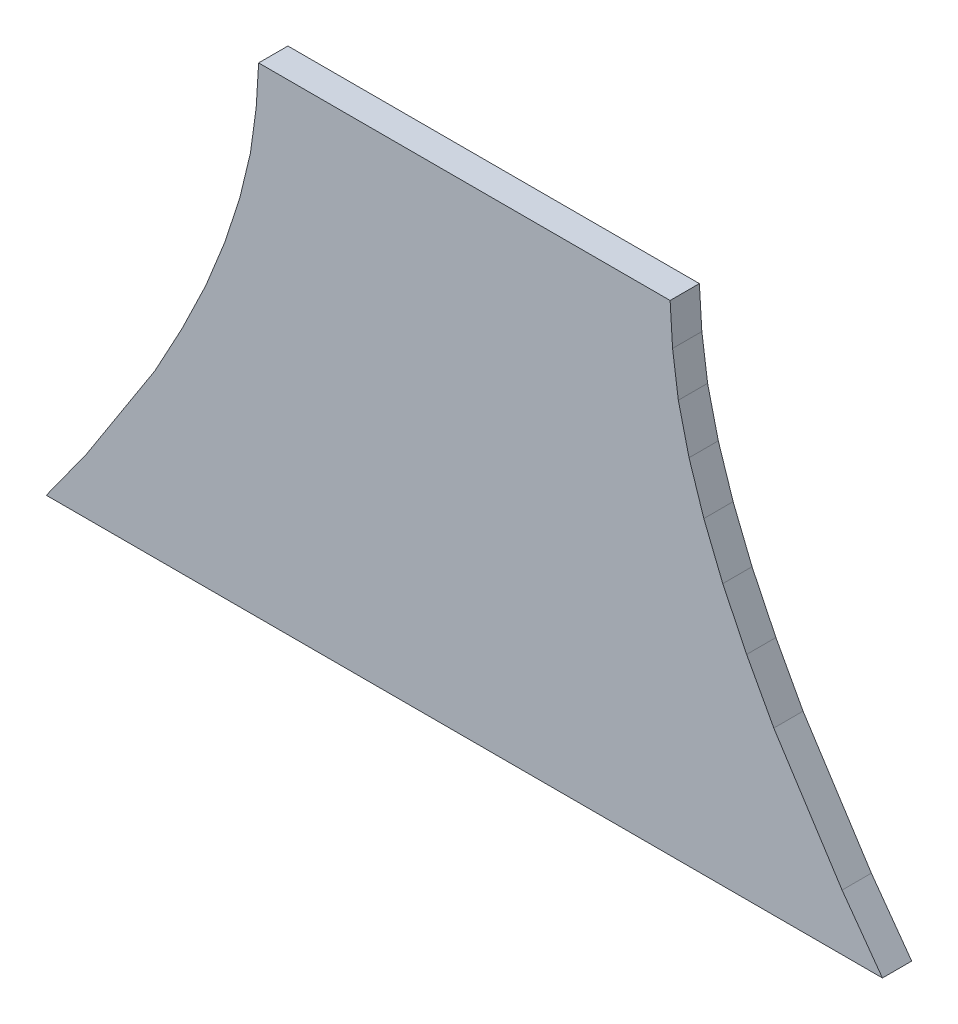
ISO-10303-21;
HEADER;
FILE_DESCRIPTION(('STEP AP214'),'2;1');
FILE_NAME('part.step','',(''),(''),'','','');
FILE_SCHEMA(('AUTOMOTIVE_DESIGN { 1 0 10303 214 1 1 1 1 }'));
ENDSEC;
DATA;
#1=APPLICATION_CONTEXT('core data for automotive mechanical design processes');
#2=APPLICATION_PROTOCOL_DEFINITION('international standard','automotive_design',2000,#1);
#3=PRODUCT_CONTEXT('',#1,'mechanical');
#4=PRODUCT('Part','Part','',(#3));
#5=PRODUCT_RELATED_PRODUCT_CATEGORY('part','',(#4));
#6=PRODUCT_DEFINITION_FORMATION('','',#4);
#7=PRODUCT_DEFINITION_CONTEXT('part definition',#1,'design');
#8=PRODUCT_DEFINITION('design','',#6,#7);
#9=PRODUCT_DEFINITION_SHAPE('','',#8);
#10=(LENGTH_UNIT() NAMED_UNIT(*) SI_UNIT(.MILLI.,.METRE.));
#11=(NAMED_UNIT(*) PLANE_ANGLE_UNIT() SI_UNIT($,.RADIAN.));
#12=(NAMED_UNIT(*) SI_UNIT($,.STERADIAN.) SOLID_ANGLE_UNIT());
#13=UNCERTAINTY_MEASURE_WITH_UNIT(LENGTH_MEASURE(1.E-05),#10,'distance_accuracy_value','');
#14=(GEOMETRIC_REPRESENTATION_CONTEXT(3) GLOBAL_UNCERTAINTY_ASSIGNED_CONTEXT((#13)) GLOBAL_UNIT_ASSIGNED_CONTEXT((#10,
#11,#12)) REPRESENTATION_CONTEXT('',''));
#15=CARTESIAN_POINT('',(0.,0.,0.));
#16=DIRECTION('',(0.,0.,1.));
#17=DIRECTION('',(1.,0.,0.));
#18=AXIS2_PLACEMENT_3D('',#15,#16,#17);
#19=CARTESIAN_POINT('',(53.6500015258789,72.4649963378906,0.));
#20=DIRECTION('',(0.998128033533302,-0.0611590440976883,0.));
#21=DIRECTION('',(-0.0611590440976883,-0.998128033533302,0.));
#22=AXIS2_PLACEMENT_3D('',#19,#20,#21);
#23=PLANE('',#22);
#24=DIRECTION('',(-0.0611590440976883,-0.998128033533302,0.));
#25=VECTOR('',#24,1.);
#26=CARTESIAN_POINT('',(53.6500015258789,72.4649963378906,0.03556));
#27=LINE('',#26,#25);
#28=CARTESIAN_POINT('',(53.6500015258789,72.4649963378906,0.03556));
#29=VERTEX_POINT('',#28);
#30=CARTESIAN_POINT('',(53.6469993591309,72.4160003662109,0.03556));
#31=VERTEX_POINT('',#30);
#32=EDGE_CURVE('E11',#29,#31,#27,.T.);
#33=ORIENTED_EDGE('',*,*,#32,.F.);
#34=DIRECTION('',(0.,0.,1.));
#35=VECTOR('',#34,1.);
#36=CARTESIAN_POINT('',(53.6500015258789,72.4649963378906,0.));
#37=LINE('',#36,#35);
#38=CARTESIAN_POINT('',(53.6500015258789,72.4649963378906,0.));
#39=VERTEX_POINT('',#38);
#40=EDGE_CURVE('E24',#39,#29,#37,.T.);
#41=ORIENTED_EDGE('',*,*,#40,.F.);
#42=DIRECTION('',(-0.0611590440976883,-0.998128033533302,0.));
#43=VECTOR('',#42,1.);
#44=CARTESIAN_POINT('',(53.6500015258789,72.4649963378906,0.));
#45=LINE('',#44,#43);
#46=CARTESIAN_POINT('',(53.6469993591309,72.4160003662109,0.));
#47=VERTEX_POINT('',#46);
#48=EDGE_CURVE('E172',#39,#47,#45,.T.);
#49=ORIENTED_EDGE('',*,*,#48,.T.);
#50=DIRECTION('',(0.,0.,1.));
#51=VECTOR('',#50,1.);
#52=CARTESIAN_POINT('',(53.6469993591309,72.4160003662109,0.));
#53=LINE('',#52,#51);
#54=EDGE_CURVE('E37',#47,#31,#53,.T.);
#55=ORIENTED_EDGE('',*,*,#54,.T.);
#56=EDGE_LOOP('',(#33,#41,#49,#55));
#57=FACE_BOUND('',#56,.T.);
#58=ADVANCED_FACE('F17',(#57),#23,.F.);
#59=CARTESIAN_POINT('',(53.6469993591309,72.416000366211,0.));
#60=DIRECTION('',(0.990712558253608,-0.135972890381105,0.));
#61=DIRECTION('',(-0.135972890381105,-0.990712558253608,0.));
#62=AXIS2_PLACEMENT_3D('',#59,#60,#61);
#63=PLANE('',#62);
#64=DIRECTION('',(-0.135972890381105,-0.990712558253608,0.));
#65=VECTOR('',#64,1.);
#66=CARTESIAN_POINT('',(53.6469993591309,72.4160003662109,0.03556));
#67=LINE('',#66,#65);
#68=CARTESIAN_POINT('',(53.6399993896484,72.3649978637695,0.03556));
#69=VERTEX_POINT('',#68);
#70=EDGE_CURVE('E308',#31,#69,#67,.T.);
#71=ORIENTED_EDGE('',*,*,#70,.F.);
#72=ORIENTED_EDGE('',*,*,#54,.F.);
#73=DIRECTION('',(-0.135972890381105,-0.990712558253608,0.));
#74=VECTOR('',#73,1.);
#75=CARTESIAN_POINT('',(53.6469993591309,72.4160003662109,0.));
#76=LINE('',#75,#74);
#77=CARTESIAN_POINT('',(53.6399993896484,72.3649978637695,0.));
#78=VERTEX_POINT('',#77);
#79=EDGE_CURVE('E305',#47,#78,#76,.T.);
#80=ORIENTED_EDGE('',*,*,#79,.T.);
#81=DIRECTION('',(0.,0.,1.));
#82=VECTOR('',#81,1.);
#83=CARTESIAN_POINT('',(53.6399993896484,72.3649978637695,0.));
#84=LINE('',#83,#82);
#85=EDGE_CURVE('E303',#78,#69,#84,.T.);
#86=ORIENTED_EDGE('',*,*,#85,.T.);
#87=EDGE_LOOP('',(#71,#72,#80,#86));
#88=FACE_BOUND('',#87,.T.);
#89=ADVANCED_FACE('F316',(#88),#63,.F.);
#90=CARTESIAN_POINT('',(53.6399993896484,72.3649978637695,0.));
#91=DIRECTION('',(0.972222479506538,-0.234058647227909,0.));
#92=DIRECTION('',(-0.234058647227909,-0.972222479506538,0.));
#93=AXIS2_PLACEMENT_3D('',#90,#91,#92);
#94=PLANE('',#93);
#95=DIRECTION('',(-0.234058647227909,-0.972222479506538,0.));
#96=VECTOR('',#95,1.);
#97=CARTESIAN_POINT('',(53.6399993896484,72.3649978637695,0.03556));
#98=LINE('',#97,#96);
#99=CARTESIAN_POINT('',(53.6269989013672,72.3109970092774,0.03556));
#100=VERTEX_POINT('',#99);
#101=EDGE_CURVE('E300',#69,#100,#98,.T.);
#102=ORIENTED_EDGE('',*,*,#101,.F.);
#103=ORIENTED_EDGE('',*,*,#85,.F.);
#104=DIRECTION('',(-0.234058647227909,-0.972222479506538,0.));
#105=VECTOR('',#104,1.);
#106=CARTESIAN_POINT('',(53.6399993896484,72.3649978637695,0.));
#107=LINE('',#106,#105);
#108=CARTESIAN_POINT('',(53.6269989013672,72.3109970092774,0.));
#109=VERTEX_POINT('',#108);
#110=EDGE_CURVE('E297',#78,#109,#107,.T.);
#111=ORIENTED_EDGE('',*,*,#110,.T.);
#112=DIRECTION('',(0.,0.,1.));
#113=VECTOR('',#112,1.);
#114=CARTESIAN_POINT('',(53.6269989013672,72.3109970092774,0.));
#115=LINE('',#114,#113);
#116=EDGE_CURVE('E295',#109,#100,#115,.T.);
#117=ORIENTED_EDGE('',*,*,#116,.T.);
#118=EDGE_LOOP('',(#102,#103,#111,#117));
#119=FACE_BOUND('',#118,.T.);
#120=ADVANCED_FACE('F322',(#119),#94,.F.);
#121=CARTESIAN_POINT('',(53.6269989013672,72.3109970092774,0.));
#122=DIRECTION('',(0.950409174304617,-0.311002253042668,0.));
#123=DIRECTION('',(-0.311002253042668,-0.950409174304617,0.));
#124=AXIS2_PLACEMENT_3D('',#121,#122,#123);
#125=PLANE('',#124);
#126=DIRECTION('',(-0.311002253042668,-0.950409174304617,0.));
#127=VECTOR('',#126,1.);
#128=CARTESIAN_POINT('',(53.6269989013672,72.3109970092774,0.03556));
#129=LINE('',#128,#127);
#130=CARTESIAN_POINT('',(53.609001159668,72.2559967041016,0.03556));
#131=VERTEX_POINT('',#130);
#132=EDGE_CURVE('E292',#100,#131,#129,.T.);
#133=ORIENTED_EDGE('',*,*,#132,.F.);
#134=ORIENTED_EDGE('',*,*,#116,.F.);
#135=DIRECTION('',(-0.311002253042668,-0.950409174304617,0.));
#136=VECTOR('',#135,1.);
#137=CARTESIAN_POINT('',(53.6269989013672,72.3109970092774,0.));
#138=LINE('',#137,#136);
#139=CARTESIAN_POINT('',(53.609001159668,72.2559967041016,0.));
#140=VERTEX_POINT('',#139);
#141=EDGE_CURVE('E289',#109,#140,#138,.T.);
#142=ORIENTED_EDGE('',*,*,#141,.T.);
#143=DIRECTION('',(0.,0.,1.));
#144=VECTOR('',#143,1.);
#145=CARTESIAN_POINT('',(53.609001159668,72.2559967041016,0.));
#146=LINE('',#145,#144);
#147=EDGE_CURVE('E287',#140,#131,#146,.T.);
#148=ORIENTED_EDGE('',*,*,#147,.T.);
#149=EDGE_LOOP('',(#133,#134,#142,#148));
#150=FACE_BOUND('',#149,.T.);
#151=ADVANCED_FACE('F324',(#150),#125,.F.);
#152=CARTESIAN_POINT('',(53.609001159668,72.2559967041016,0.));
#153=DIRECTION('',(0.927333807250236,-0.374235233417141,0.));
#154=DIRECTION('',(-0.374235233417141,-0.927333807250236,0.));
#155=AXIS2_PLACEMENT_3D('',#152,#153,#154);
#156=PLANE('',#155);
#157=DIRECTION('',(-0.374235233417141,-0.927333807250236,0.));
#158=VECTOR('',#157,1.);
#159=CARTESIAN_POINT('',(53.609001159668,72.2559967041016,0.03556));
#160=LINE('',#159,#158);
#161=CARTESIAN_POINT('',(53.5859985351563,72.1989974975586,0.03556));
#162=VERTEX_POINT('',#161);
#163=EDGE_CURVE('E284',#131,#162,#160,.T.);
#164=ORIENTED_EDGE('',*,*,#163,.F.);
#165=ORIENTED_EDGE('',*,*,#147,.F.);
#166=DIRECTION('',(-0.374235233417141,-0.927333807250236,0.));
#167=VECTOR('',#166,1.);
#168=CARTESIAN_POINT('',(53.609001159668,72.2559967041016,0.));
#169=LINE('',#168,#167);
#170=CARTESIAN_POINT('',(53.5859985351563,72.1989974975586,0.));
#171=VERTEX_POINT('',#170);
#172=EDGE_CURVE('E281',#140,#171,#169,.T.);
#173=ORIENTED_EDGE('',*,*,#172,.T.);
#174=DIRECTION('',(0.,0.,1.));
#175=VECTOR('',#174,1.);
#176=CARTESIAN_POINT('',(53.5859985351563,72.1989974975586,0.));
#177=LINE('',#176,#175);
#178=EDGE_CURVE('E279',#171,#162,#177,.T.);
#179=ORIENTED_EDGE('',*,*,#178,.T.);
#180=EDGE_LOOP('',(#164,#165,#173,#179));
#181=FACE_BOUND('',#180,.T.);
#182=ADVANCED_FACE('F329',(#181),#156,.F.);
#183=CARTESIAN_POINT('',(53.5859985351563,72.1989974975586,0.));
#184=DIRECTION('',(0.900345962325327,-0.435174847761771,0.));
#185=DIRECTION('',(-0.435174847761771,-0.900345962325327,0.));
#186=AXIS2_PLACEMENT_3D('',#183,#184,#185);
#187=PLANE('',#186);
#188=DIRECTION('',(-0.435174847761771,-0.900345962325327,0.));
#189=VECTOR('',#188,1.);
#190=CARTESIAN_POINT('',(53.5859985351563,72.1989974975586,0.03556));
#191=LINE('',#190,#189);
#192=CARTESIAN_POINT('',(53.556999206543,72.1389999389648,0.03556));
#193=VERTEX_POINT('',#192);
#194=EDGE_CURVE('E276',#162,#193,#191,.T.);
#195=ORIENTED_EDGE('',*,*,#194,.F.);
#196=ORIENTED_EDGE('',*,*,#178,.F.);
#197=DIRECTION('',(-0.435174847761771,-0.900345962325327,0.));
#198=VECTOR('',#197,1.);
#199=CARTESIAN_POINT('',(53.5859985351563,72.1989974975586,0.));
#200=LINE('',#199,#198);
#201=CARTESIAN_POINT('',(53.556999206543,72.1389999389648,0.));
#202=VERTEX_POINT('',#201);
#203=EDGE_CURVE('E273',#171,#202,#200,.T.);
#204=ORIENTED_EDGE('',*,*,#203,.T.);
#205=DIRECTION('',(0.,0.,1.));
#206=VECTOR('',#205,1.);
#207=CARTESIAN_POINT('',(53.556999206543,72.1389999389648,0.));
#208=LINE('',#207,#206);
#209=EDGE_CURVE('E271',#202,#193,#208,.T.);
#210=ORIENTED_EDGE('',*,*,#209,.T.);
#211=EDGE_LOOP('',(#195,#196,#204,#210));
#212=FACE_BOUND('',#211,.T.);
#213=ADVANCED_FACE('F332',(#212),#187,.F.);
#214=CARTESIAN_POINT('',(53.556999206543,72.1389999389648,0.));
#215=DIRECTION('',(0.879527973380277,-0.475847185598047,0.));
#216=DIRECTION('',(-0.475847185598047,-0.879527973380277,0.));
#217=AXIS2_PLACEMENT_3D('',#214,#215,#216);
#218=PLANE('',#217);
#219=DIRECTION('',(-0.475847185598047,-0.879527973380277,0.));
#220=VECTOR('',#219,1.);
#221=CARTESIAN_POINT('',(53.556999206543,72.1389999389648,0.03556));
#222=LINE('',#221,#220);
#223=CARTESIAN_POINT('',(53.523998260498,72.0780029296875,0.03556));
#224=VERTEX_POINT('',#223);
#225=EDGE_CURVE('E268',#193,#224,#222,.T.);
#226=ORIENTED_EDGE('',*,*,#225,.F.);
#227=ORIENTED_EDGE('',*,*,#209,.F.);
#228=DIRECTION('',(-0.475847185598047,-0.879527973380277,0.));
#229=VECTOR('',#228,1.);
#230=CARTESIAN_POINT('',(53.556999206543,72.1389999389648,0.));
#231=LINE('',#230,#229);
#232=CARTESIAN_POINT('',(53.523998260498,72.0780029296875,0.));
#233=VERTEX_POINT('',#232);
#234=EDGE_CURVE('E265',#202,#233,#231,.T.);
#235=ORIENTED_EDGE('',*,*,#234,.T.);
#236=DIRECTION('',(0.,0.,1.));
#237=VECTOR('',#236,1.);
#238=CARTESIAN_POINT('',(53.523998260498,72.0780029296875,0.));
#239=LINE('',#238,#237);
#240=EDGE_CURVE('E263',#233,#224,#239,.T.);
#241=ORIENTED_EDGE('',*,*,#240,.T.);
#242=EDGE_LOOP('',(#226,#227,#235,#241));
#243=FACE_BOUND('',#242,.T.);
#244=ADVANCED_FACE('F337',(#243),#218,.F.);
#245=CARTESIAN_POINT('',(53.523998260498,72.0780029296875,0.));
#246=DIRECTION('',(0.840987738097745,-0.541054178774399,0.));
#247=DIRECTION('',(-0.541054178774399,-0.840987738097745,0.));
#248=AXIS2_PLACEMENT_3D('',#245,#246,#247);
#249=PLANE('',#248);
#250=DIRECTION('',(-0.541054178774399,-0.840987738097745,0.));
#251=VECTOR('',#250,1.);
#252=CARTESIAN_POINT('',(53.523998260498,72.0780029296875,0.03556));
#253=LINE('',#252,#251);
#254=CARTESIAN_POINT('',(53.4410018920898,71.9489974975586,0.03556));
#255=VERTEX_POINT('',#254);
#256=EDGE_CURVE('E260',#224,#255,#253,.T.);
#257=ORIENTED_EDGE('',*,*,#256,.F.);
#258=ORIENTED_EDGE('',*,*,#240,.F.);
#259=DIRECTION('',(-0.541054178774399,-0.840987738097745,0.));
#260=VECTOR('',#259,1.);
#261=CARTESIAN_POINT('',(53.523998260498,72.0780029296875,0.));
#262=LINE('',#261,#260);
#263=CARTESIAN_POINT('',(53.4410018920898,71.9489974975586,0.));
#264=VERTEX_POINT('',#263);
#265=EDGE_CURVE('E257',#233,#264,#262,.T.);
#266=ORIENTED_EDGE('',*,*,#265,.T.);
#267=DIRECTION('',(0.,0.,1.));
#268=VECTOR('',#267,1.);
#269=CARTESIAN_POINT('',(53.4410018920898,71.9489974975586,0.));
#270=LINE('',#269,#268);
#271=EDGE_CURVE('E255',#264,#255,#270,.T.);
#272=ORIENTED_EDGE('',*,*,#271,.T.);
#273=EDGE_LOOP('',(#257,#258,#266,#272));
#274=FACE_BOUND('',#273,.T.);
#275=ADVANCED_FACE('F340',(#274),#249,.F.);
#276=CARTESIAN_POINT('',(53.4410018920899,71.9489974975586,0.));
#277=DIRECTION('',(0.811290838795875,-0.584642775450006,0.));
#278=DIRECTION('',(-0.584642775450006,-0.811290838795875,0.));
#279=AXIS2_PLACEMENT_3D('',#276,#277,#278);
#280=PLANE('',#279);
#281=DIRECTION('',(-0.584642775450006,-0.811290838795875,0.));
#282=VECTOR('',#281,1.);
#283=CARTESIAN_POINT('',(53.4410018920898,71.9489974975586,0.03556));
#284=LINE('',#283,#282);
#285=CARTESIAN_POINT('',(53.3919982910156,71.8809967041016,0.03556));
#286=VERTEX_POINT('',#285);
#287=EDGE_CURVE('E252',#255,#286,#284,.T.);
#288=ORIENTED_EDGE('',*,*,#287,.F.);
#289=ORIENTED_EDGE('',*,*,#271,.F.);
#290=DIRECTION('',(-0.584642775450006,-0.811290838795875,0.));
#291=VECTOR('',#290,1.);
#292=CARTESIAN_POINT('',(53.4410018920898,71.9489974975586,0.));
#293=LINE('',#292,#291);
#294=CARTESIAN_POINT('',(53.3919982910156,71.8809967041016,0.));
#295=VERTEX_POINT('',#294);
#296=EDGE_CURVE('E249',#264,#295,#293,.T.);
#297=ORIENTED_EDGE('',*,*,#296,.T.);
#298=DIRECTION('',(0.,0.,1.));
#299=VECTOR('',#298,1.);
#300=CARTESIAN_POINT('',(53.3919982910156,71.8809967041016,0.));
#301=LINE('',#300,#299);
#302=EDGE_CURVE('E247',#295,#286,#301,.T.);
#303=ORIENTED_EDGE('',*,*,#302,.T.);
#304=EDGE_LOOP('',(#288,#289,#297,#303));
#305=FACE_BOUND('',#304,.T.);
#306=ADVANCED_FACE('F345',(#305),#280,.F.);
#307=CARTESIAN_POINT('',(53.3919982910156,71.8809967041016,0.));
#308=DIRECTION('',(0.,1.,0.));
#309=DIRECTION('',(1.,0.,0.));
#310=AXIS2_PLACEMENT_3D('',#307,#308,#309);
#311=PLANE('',#310);
#312=DIRECTION('',(1.,0.,0.));
#313=VECTOR('',#312,1.);
#314=CARTESIAN_POINT('',(53.3919982910156,71.8809967041016,0.03556));
#315=LINE('',#314,#313);
#316=CARTESIAN_POINT('',(54.4080009460449,71.8809967041016,0.03556));
#317=VERTEX_POINT('',#316);
#318=EDGE_CURVE('E244',#286,#317,#315,.T.);
#319=ORIENTED_EDGE('',*,*,#318,.F.);
#320=ORIENTED_EDGE('',*,*,#302,.F.);
#321=DIRECTION('',(1.,0.,0.));
#322=VECTOR('',#321,1.);
#323=CARTESIAN_POINT('',(53.3919982910156,71.8809967041016,0.));
#324=LINE('',#323,#322);
#325=CARTESIAN_POINT('',(54.4080009460449,71.8809967041016,0.));
#326=VERTEX_POINT('',#325);
#327=EDGE_CURVE('E241',#295,#326,#324,.T.);
#328=ORIENTED_EDGE('',*,*,#327,.T.);
#329=DIRECTION('',(0.,0.,1.));
#330=VECTOR('',#329,1.);
#331=CARTESIAN_POINT('',(54.4080009460449,71.8809967041016,0.));
#332=LINE('',#331,#330);
#333=EDGE_CURVE('E239',#326,#317,#332,.T.);
#334=ORIENTED_EDGE('',*,*,#333,.T.);
#335=EDGE_LOOP('',(#319,#320,#328,#334));
#336=FACE_BOUND('',#335,.T.);
#337=ADVANCED_FACE('F348',(#336),#311,.F.);
#338=CARTESIAN_POINT('',(54.4080009460449,71.8809967041016,0.));
#339=DIRECTION('',(-0.811312425694803,-0.584612818806785,0.));
#340=DIRECTION('',(-0.584612818806785,0.811312425694803,0.));
#341=AXIS2_PLACEMENT_3D('',#338,#339,#340);
#342=PLANE('',#341);
#343=DIRECTION('',(-0.584612818806785,0.811312425694803,0.));
#344=VECTOR('',#343,1.);
#345=CARTESIAN_POINT('',(54.4080009460449,71.8809967041016,0.03556));
#346=LINE('',#345,#344);
#347=CARTESIAN_POINT('',(54.359001159668,71.9489974975586,0.03556));
#348=VERTEX_POINT('',#347);
#349=EDGE_CURVE('E236',#317,#348,#346,.T.);
#350=ORIENTED_EDGE('',*,*,#349,.F.);
#351=ORIENTED_EDGE('',*,*,#333,.F.);
#352=DIRECTION('',(-0.584612818806785,0.811312425694803,0.));
#353=VECTOR('',#352,1.);
#354=CARTESIAN_POINT('',(54.4080009460449,71.8809967041016,0.));
#355=LINE('',#354,#353);
#356=CARTESIAN_POINT('',(54.359001159668,71.9489974975586,0.));
#357=VERTEX_POINT('',#356);
#358=EDGE_CURVE('E233',#326,#357,#355,.T.);
#359=ORIENTED_EDGE('',*,*,#358,.T.);
#360=DIRECTION('',(0.,0.,1.));
#361=VECTOR('',#360,1.);
#362=CARTESIAN_POINT('',(54.359001159668,71.9489974975586,0.));
#363=LINE('',#362,#361);
#364=EDGE_CURVE('E231',#357,#348,#363,.T.);
#365=ORIENTED_EDGE('',*,*,#364,.T.);
#366=EDGE_LOOP('',(#350,#351,#359,#365));
#367=FACE_BOUND('',#366,.T.);
#368=ADVANCED_FACE('F353',(#367),#342,.F.);
#369=CARTESIAN_POINT('',(54.359001159668,71.9489974975586,0.));
#370=DIRECTION('',(-0.8409764226074,-0.541071766606298,0.));
#371=DIRECTION('',(-0.541071766606298,0.8409764226074,0.));
#372=AXIS2_PLACEMENT_3D('',#369,#370,#371);
#373=PLANE('',#372);
#374=DIRECTION('',(-0.541071766606298,0.8409764226074,0.));
#375=VECTOR('',#374,1.);
#376=CARTESIAN_POINT('',(54.359001159668,71.9489974975586,0.03556));
#377=LINE('',#376,#375);
#378=CARTESIAN_POINT('',(54.2760009765625,72.0780029296875,0.03556));
#379=VERTEX_POINT('',#378);
#380=EDGE_CURVE('E228',#348,#379,#377,.T.);
#381=ORIENTED_EDGE('',*,*,#380,.F.);
#382=ORIENTED_EDGE('',*,*,#364,.F.);
#383=DIRECTION('',(-0.541071766606298,0.8409764226074,0.));
#384=VECTOR('',#383,1.);
#385=CARTESIAN_POINT('',(54.359001159668,71.9489974975586,0.));
#386=LINE('',#385,#384);
#387=CARTESIAN_POINT('',(54.2760009765625,72.0780029296875,0.));
#388=VERTEX_POINT('',#387);
#389=EDGE_CURVE('E225',#357,#388,#386,.T.);
#390=ORIENTED_EDGE('',*,*,#389,.T.);
#391=DIRECTION('',(0.,0.,1.));
#392=VECTOR('',#391,1.);
#393=CARTESIAN_POINT('',(54.2760009765625,72.0780029296875,0.));
#394=LINE('',#393,#392);
#395=EDGE_CURVE('E223',#388,#379,#394,.T.);
#396=ORIENTED_EDGE('',*,*,#395,.T.);
#397=EDGE_LOOP('',(#381,#382,#390,#396));
#398=FACE_BOUND('',#397,.T.);
#399=ADVANCED_FACE('F356',(#398),#373,.F.);
#400=CARTESIAN_POINT('',(54.2760009765625,72.0780029296875,0.));
#401=DIRECTION('',(-0.879527973380277,-0.475847185598047,0.));
#402=DIRECTION('',(-0.475847185598047,0.879527973380277,0.));
#403=AXIS2_PLACEMENT_3D('',#400,#401,#402);
#404=PLANE('',#403);
#405=DIRECTION('',(-0.475847185598047,0.879527973380277,0.));
#406=VECTOR('',#405,1.);
#407=CARTESIAN_POINT('',(54.2760009765625,72.0780029296875,0.03556));
#408=LINE('',#407,#406);
#409=CARTESIAN_POINT('',(54.2430000305176,72.1389999389648,0.03556));
#410=VERTEX_POINT('',#409);
#411=EDGE_CURVE('E220',#379,#410,#408,.T.);
#412=ORIENTED_EDGE('',*,*,#411,.F.);
#413=ORIENTED_EDGE('',*,*,#395,.F.);
#414=DIRECTION('',(-0.475847185598047,0.879527973380277,0.));
#415=VECTOR('',#414,1.);
#416=CARTESIAN_POINT('',(54.2760009765625,72.0780029296875,0.));
#417=LINE('',#416,#415);
#418=CARTESIAN_POINT('',(54.2430000305176,72.1389999389648,0.));
#419=VERTEX_POINT('',#418);
#420=EDGE_CURVE('E217',#388,#419,#417,.T.);
#421=ORIENTED_EDGE('',*,*,#420,.T.);
#422=DIRECTION('',(0.,0.,1.));
#423=VECTOR('',#422,1.);
#424=CARTESIAN_POINT('',(54.2430000305176,72.1389999389648,0.));
#425=LINE('',#424,#423);
#426=EDGE_CURVE('E215',#419,#410,#425,.T.);
#427=ORIENTED_EDGE('',*,*,#426,.T.);
#428=EDGE_LOOP('',(#412,#413,#421,#427));
#429=FACE_BOUND('',#428,.T.);
#430=ADVANCED_FACE('F361',(#429),#404,.F.);
#431=CARTESIAN_POINT('',(54.2430000305176,72.1389999389648,0.));
#432=DIRECTION('',(-0.900345962325327,-0.435174847761771,0.));
#433=DIRECTION('',(-0.435174847761771,0.900345962325327,0.));
#434=AXIS2_PLACEMENT_3D('',#431,#432,#433);
#435=PLANE('',#434);
#436=DIRECTION('',(-0.435174847761771,0.900345962325327,0.));
#437=VECTOR('',#436,1.);
#438=CARTESIAN_POINT('',(54.2430000305176,72.1389999389648,0.03556));
#439=LINE('',#438,#437);
#440=CARTESIAN_POINT('',(54.2140007019043,72.1989974975586,0.03556));
#441=VERTEX_POINT('',#440);
#442=EDGE_CURVE('E212',#410,#441,#439,.T.);
#443=ORIENTED_EDGE('',*,*,#442,.F.);
#444=ORIENTED_EDGE('',*,*,#426,.F.);
#445=DIRECTION('',(-0.435174847761771,0.900345962325327,0.));
#446=VECTOR('',#445,1.);
#447=CARTESIAN_POINT('',(54.2430000305176,72.1389999389648,0.));
#448=LINE('',#447,#446);
#449=CARTESIAN_POINT('',(54.2140007019043,72.1989974975586,0.));
#450=VERTEX_POINT('',#449);
#451=EDGE_CURVE('E209',#419,#450,#448,.T.);
#452=ORIENTED_EDGE('',*,*,#451,.T.);
#453=DIRECTION('',(0.,0.,1.));
#454=VECTOR('',#453,1.);
#455=CARTESIAN_POINT('',(54.2140007019043,72.1989974975586,0.));
#456=LINE('',#455,#454);
#457=EDGE_CURVE('E207',#450,#441,#456,.T.);
#458=ORIENTED_EDGE('',*,*,#457,.T.);
#459=EDGE_LOOP('',(#443,#444,#452,#458));
#460=FACE_BOUND('',#459,.T.);
#461=ADVANCED_FACE('F364',(#460),#435,.F.);
#462=CARTESIAN_POINT('',(54.2140007019043,72.1989974975586,0.));
#463=DIRECTION('',(-0.927355344351169,-0.37418186126979,0.));
#464=DIRECTION('',(-0.37418186126979,0.927355344351169,0.));
#465=AXIS2_PLACEMENT_3D('',#462,#463,#464);
#466=PLANE('',#465);
#467=DIRECTION('',(-0.37418186126979,0.927355344351169,0.));
#468=VECTOR('',#467,1.);
#469=CARTESIAN_POINT('',(54.2140007019043,72.1989974975586,0.03556));
#470=LINE('',#469,#468);
#471=CARTESIAN_POINT('',(54.1910018920898,72.2559967041016,0.03556));
#472=VERTEX_POINT('',#471);
#473=EDGE_CURVE('E204',#441,#472,#470,.T.);
#474=ORIENTED_EDGE('',*,*,#473,.F.);
#475=ORIENTED_EDGE('',*,*,#457,.F.);
#476=DIRECTION('',(-0.37418186126979,0.927355344351169,0.));
#477=VECTOR('',#476,1.);
#478=CARTESIAN_POINT('',(54.2140007019043,72.1989974975586,0.));
#479=LINE('',#478,#477);
#480=CARTESIAN_POINT('',(54.1910018920898,72.2559967041016,0.));
#481=VERTEX_POINT('',#480);
#482=EDGE_CURVE('E201',#450,#481,#479,.T.);
#483=ORIENTED_EDGE('',*,*,#482,.T.);
#484=DIRECTION('',(0.,0.,1.));
#485=VECTOR('',#484,1.);
#486=CARTESIAN_POINT('',(54.1910018920898,72.2559967041016,0.));
#487=LINE('',#486,#485);
#488=EDGE_CURVE('E199',#481,#472,#487,.T.);
#489=ORIENTED_EDGE('',*,*,#488,.T.);
#490=EDGE_LOOP('',(#474,#475,#483,#489));
#491=FACE_BOUND('',#490,.T.);
#492=ADVANCED_FACE('F369',(#491),#466,.F.);
#493=CARTESIAN_POINT('',(54.1910018920898,72.2559967041016,0.));
#494=DIRECTION('',(-0.950389688765753,-0.311061793680509,0.));
#495=DIRECTION('',(-0.311061793680509,0.950389688765753,0.));
#496=AXIS2_PLACEMENT_3D('',#493,#494,#495);
#497=PLANE('',#496);
#498=DIRECTION('',(-0.311061793680509,0.950389688765753,0.));
#499=VECTOR('',#498,1.);
#500=CARTESIAN_POINT('',(54.1910018920898,72.2559967041016,0.03556));
#501=LINE('',#500,#499);
#502=CARTESIAN_POINT('',(54.1730003356934,72.3109970092774,0.03556));
#503=VERTEX_POINT('',#502);
#504=EDGE_CURVE('E196',#472,#503,#501,.T.);
#505=ORIENTED_EDGE('',*,*,#504,.F.);
#506=ORIENTED_EDGE('',*,*,#488,.F.);
#507=DIRECTION('',(-0.311061793680509,0.950389688765753,0.));
#508=VECTOR('',#507,1.);
#509=CARTESIAN_POINT('',(54.1910018920898,72.2559967041016,0.));
#510=LINE('',#509,#508);
#511=CARTESIAN_POINT('',(54.1730003356934,72.3109970092774,0.));
#512=VERTEX_POINT('',#511);
#513=EDGE_CURVE('E193',#481,#512,#510,.T.);
#514=ORIENTED_EDGE('',*,*,#513,.T.);
#515=DIRECTION('',(0.,0.,1.));
#516=VECTOR('',#515,1.);
#517=CARTESIAN_POINT('',(54.1730003356934,72.3109970092774,0.));
#518=LINE('',#517,#516);
#519=EDGE_CURVE('E191',#512,#503,#518,.T.);
#520=ORIENTED_EDGE('',*,*,#519,.T.);
#521=EDGE_LOOP('',(#505,#506,#514,#520));
#522=FACE_BOUND('',#521,.T.);
#523=ADVANCED_FACE('F372',(#522),#497,.F.);
#524=CARTESIAN_POINT('',(54.1730003356934,72.3109970092774,0.));
#525=DIRECTION('',(-0.972222479506538,-0.234058647227909,0.));
#526=DIRECTION('',(-0.234058647227909,0.972222479506538,0.));
#527=AXIS2_PLACEMENT_3D('',#524,#525,#526);
#528=PLANE('',#527);
#529=DIRECTION('',(-0.234058647227909,0.972222479506538,0.));
#530=VECTOR('',#529,1.);
#531=CARTESIAN_POINT('',(54.1730003356934,72.3109970092774,0.03556));
#532=LINE('',#531,#530);
#533=CARTESIAN_POINT('',(54.1599998474121,72.3649978637695,0.03556));
#534=VERTEX_POINT('',#533);
#535=EDGE_CURVE('E188',#503,#534,#532,.T.);
#536=ORIENTED_EDGE('',*,*,#535,.F.);
#537=ORIENTED_EDGE('',*,*,#519,.F.);
#538=DIRECTION('',(-0.234058647227909,0.972222479506538,0.));
#539=VECTOR('',#538,1.);
#540=CARTESIAN_POINT('',(54.1730003356934,72.3109970092774,0.));
#541=LINE('',#540,#539);
#542=CARTESIAN_POINT('',(54.1599998474121,72.3649978637695,0.));
#543=VERTEX_POINT('',#542);
#544=EDGE_CURVE('E185',#512,#543,#541,.T.);
#545=ORIENTED_EDGE('',*,*,#544,.T.);
#546=DIRECTION('',(0.,0.,1.));
#547=VECTOR('',#546,1.);
#548=CARTESIAN_POINT('',(54.1599998474121,72.3649978637695,0.));
#549=LINE('',#548,#547);
#550=EDGE_CURVE('E183',#543,#534,#549,.T.);
#551=ORIENTED_EDGE('',*,*,#550,.T.);
#552=EDGE_LOOP('',(#536,#537,#545,#551));
#553=FACE_BOUND('',#552,.T.);
#554=ADVANCED_FACE('F377',(#553),#528,.F.);
#555=CARTESIAN_POINT('',(54.1599998474121,72.3649978637695,0.));
#556=DIRECTION('',(-0.990712558253608,-0.135972890381105,0.));
#557=DIRECTION('',(-0.135972890381105,0.990712558253608,0.));
#558=AXIS2_PLACEMENT_3D('',#555,#556,#557);
#559=PLANE('',#558);
#560=DIRECTION('',(-0.135972890381105,0.990712558253608,0.));
#561=VECTOR('',#560,1.);
#562=CARTESIAN_POINT('',(54.1599998474121,72.3649978637695,0.03556));
#563=LINE('',#562,#561);
#564=CARTESIAN_POINT('',(54.1529998779297,72.4160003662109,0.03556));
#565=VERTEX_POINT('',#564);
#566=EDGE_CURVE('E180',#534,#565,#563,.T.);
#567=ORIENTED_EDGE('',*,*,#566,.F.);
#568=ORIENTED_EDGE('',*,*,#550,.F.);
#569=DIRECTION('',(-0.135972890381105,0.990712558253608,0.));
#570=VECTOR('',#569,1.);
#571=CARTESIAN_POINT('',(54.1599998474121,72.3649978637695,0.));
#572=LINE('',#571,#570);
#573=CARTESIAN_POINT('',(54.1529998779297,72.4160003662109,0.));
#574=VERTEX_POINT('',#573);
#575=EDGE_CURVE('E178',#543,#574,#572,.T.);
#576=ORIENTED_EDGE('',*,*,#575,.T.);
#577=DIRECTION('',(0.,0.,1.));
#578=VECTOR('',#577,1.);
#579=CARTESIAN_POINT('',(54.1529998779297,72.4160003662109,0.));
#580=LINE('',#579,#578);
#581=EDGE_CURVE('E163',#574,#565,#580,.T.);
#582=ORIENTED_EDGE('',*,*,#581,.T.);
#583=EDGE_LOOP('',(#567,#568,#576,#582));
#584=FACE_BOUND('',#583,.T.);
#585=ADVANCED_FACE('F379',(#584),#559,.F.);
#586=CARTESIAN_POINT('',(54.1529998779297,72.416000366211,0.));
#587=DIRECTION('',(-0.99813277442449,-0.0610816226018101,0.));
#588=DIRECTION('',(-0.0610816226018101,0.99813277442449,0.));
#589=AXIS2_PLACEMENT_3D('',#586,#587,#588);
#590=PLANE('',#589);
#591=DIRECTION('',(-0.0610816226018101,0.99813277442449,0.));
#592=VECTOR('',#591,1.);
#593=CARTESIAN_POINT('',(54.1529998779297,72.4160003662109,0.03556));
#594=LINE('',#593,#592);
#595=CARTESIAN_POINT('',(54.1500015258789,72.4649963378906,0.03556));
#596=VERTEX_POINT('',#595);
#597=EDGE_CURVE('E167',#565,#596,#594,.T.);
#598=ORIENTED_EDGE('',*,*,#597,.F.);
#599=ORIENTED_EDGE('',*,*,#581,.F.);
#600=DIRECTION('',(-0.0610816226018101,0.99813277442449,0.));
#601=VECTOR('',#600,1.);
#602=CARTESIAN_POINT('',(54.1529998779297,72.4160003662109,0.));
#603=LINE('',#602,#601);
#604=CARTESIAN_POINT('',(54.1500015258789,72.4649963378906,0.));
#605=VERTEX_POINT('',#604);
#606=EDGE_CURVE('E159',#574,#605,#603,.T.);
#607=ORIENTED_EDGE('',*,*,#606,.T.);
#608=DIRECTION('',(0.,0.,1.));
#609=VECTOR('',#608,1.);
#610=CARTESIAN_POINT('',(54.1500015258789,72.4649963378906,0.));
#611=LINE('',#610,#609);
#612=EDGE_CURVE('E149',#605,#596,#611,.T.);
#613=ORIENTED_EDGE('',*,*,#612,.T.);
#614=EDGE_LOOP('',(#598,#599,#607,#613));
#615=FACE_BOUND('',#614,.T.);
#616=ADVANCED_FACE('F162',(#615),#590,.F.);
#617=CARTESIAN_POINT('',(54.1500015258789,72.4649963378906,0.));
#618=DIRECTION('',(0.,-1.,0.));
#619=DIRECTION('',(-1.,0.,0.));
#620=AXIS2_PLACEMENT_3D('',#617,#618,#619);
#621=PLANE('',#620);
#622=DIRECTION('',(-1.,0.,0.));
#623=VECTOR('',#622,1.);
#624=CARTESIAN_POINT('',(54.1500015258789,72.4649963378906,0.03556));
#625=LINE('',#624,#623);
#626=EDGE_CURVE('E155',#596,#29,#625,.T.);
#627=ORIENTED_EDGE('',*,*,#626,.F.);
#628=ORIENTED_EDGE('',*,*,#612,.F.);
#629=DIRECTION('',(-1.,0.,0.));
#630=VECTOR('',#629,1.);
#631=CARTESIAN_POINT('',(54.1500015258789,72.4649963378906,0.));
#632=LINE('',#631,#630);
#633=EDGE_CURVE('E153',#605,#39,#632,.T.);
#634=ORIENTED_EDGE('',*,*,#633,.T.);
#635=ORIENTED_EDGE('',*,*,#40,.T.);
#636=EDGE_LOOP('',(#627,#628,#634,#635));
#637=FACE_BOUND('',#636,.T.);
#638=ADVANCED_FACE('F151',(#637),#621,.F.);
#639=CARTESIAN_POINT('',(53.6500015258789,72.4649963378906,0.));
#640=DIRECTION('',(0.,0.,1.));
#641=DIRECTION('',(1.,0.,0.));
#642=AXIS2_PLACEMENT_3D('',#639,#640,#641);
#643=PLANE('',#642);
#644=ORIENTED_EDGE('',*,*,#633,.F.);
#645=ORIENTED_EDGE('',*,*,#606,.F.);
#646=ORIENTED_EDGE('',*,*,#575,.F.);
#647=ORIENTED_EDGE('',*,*,#544,.F.);
#648=ORIENTED_EDGE('',*,*,#513,.F.);
#649=ORIENTED_EDGE('',*,*,#482,.F.);
#650=ORIENTED_EDGE('',*,*,#451,.F.);
#651=ORIENTED_EDGE('',*,*,#420,.F.);
#652=ORIENTED_EDGE('',*,*,#389,.F.);
#653=ORIENTED_EDGE('',*,*,#358,.F.);
#654=ORIENTED_EDGE('',*,*,#327,.F.);
#655=ORIENTED_EDGE('',*,*,#296,.F.);
#656=ORIENTED_EDGE('',*,*,#265,.F.);
#657=ORIENTED_EDGE('',*,*,#234,.F.);
#658=ORIENTED_EDGE('',*,*,#203,.F.);
#659=ORIENTED_EDGE('',*,*,#172,.F.);
#660=ORIENTED_EDGE('',*,*,#141,.F.);
#661=ORIENTED_EDGE('',*,*,#110,.F.);
#662=ORIENTED_EDGE('',*,*,#79,.F.);
#663=ORIENTED_EDGE('',*,*,#48,.F.);
#664=EDGE_LOOP('',(#644,#645,#646,#647,#648,#649,#650,#651,#652,#653,#654,#655,#656,#657,#658,
#659,#660,#661,#662,#663));
#665=FACE_BOUND('',#664,.T.);
#666=ADVANCED_FACE('F170',(#665),#643,.F.);
#667=CARTESIAN_POINT('',(53.6500015258789,72.4649963378906,0.03556));
#668=DIRECTION('',(0.,0.,1.));
#669=DIRECTION('',(1.,0.,0.));
#670=AXIS2_PLACEMENT_3D('',#667,#668,#669);
#671=PLANE('',#670);
#672=ORIENTED_EDGE('',*,*,#32,.T.);
#673=ORIENTED_EDGE('',*,*,#70,.T.);
#674=ORIENTED_EDGE('',*,*,#101,.T.);
#675=ORIENTED_EDGE('',*,*,#132,.T.);
#676=ORIENTED_EDGE('',*,*,#163,.T.);
#677=ORIENTED_EDGE('',*,*,#194,.T.);
#678=ORIENTED_EDGE('',*,*,#225,.T.);
#679=ORIENTED_EDGE('',*,*,#256,.T.);
#680=ORIENTED_EDGE('',*,*,#287,.T.);
#681=ORIENTED_EDGE('',*,*,#318,.T.);
#682=ORIENTED_EDGE('',*,*,#349,.T.);
#683=ORIENTED_EDGE('',*,*,#380,.T.);
#684=ORIENTED_EDGE('',*,*,#411,.T.);
#685=ORIENTED_EDGE('',*,*,#442,.T.);
#686=ORIENTED_EDGE('',*,*,#473,.T.);
#687=ORIENTED_EDGE('',*,*,#504,.T.);
#688=ORIENTED_EDGE('',*,*,#535,.T.);
#689=ORIENTED_EDGE('',*,*,#566,.T.);
#690=ORIENTED_EDGE('',*,*,#597,.T.);
#691=ORIENTED_EDGE('',*,*,#626,.T.);
#692=EDGE_LOOP('',(#672,#673,#674,#675,#676,#677,#678,#679,#680,#681,#682,#683,#684,#685,#686,
#687,#688,#689,#690,#691));
#693=FACE_BOUND('',#692,.T.);
#694=ADVANCED_FACE('F319',(#693),#671,.T.);
#695=CLOSED_SHELL('',(#58,#89,#120,#151,#182,#213,#244,#275,#306,#337,#368,#399,#430,#461,#492,
#523,#554,#585,#616,#638,#666,#694));
#696=MANIFOLD_SOLID_BREP('B1',#695);
#697=ADVANCED_BREP_SHAPE_REPRESENTATION('',(#18,#696),#14);
#698=SHAPE_DEFINITION_REPRESENTATION(#9,#697);
ENDSEC;
END-ISO-10303-21;
